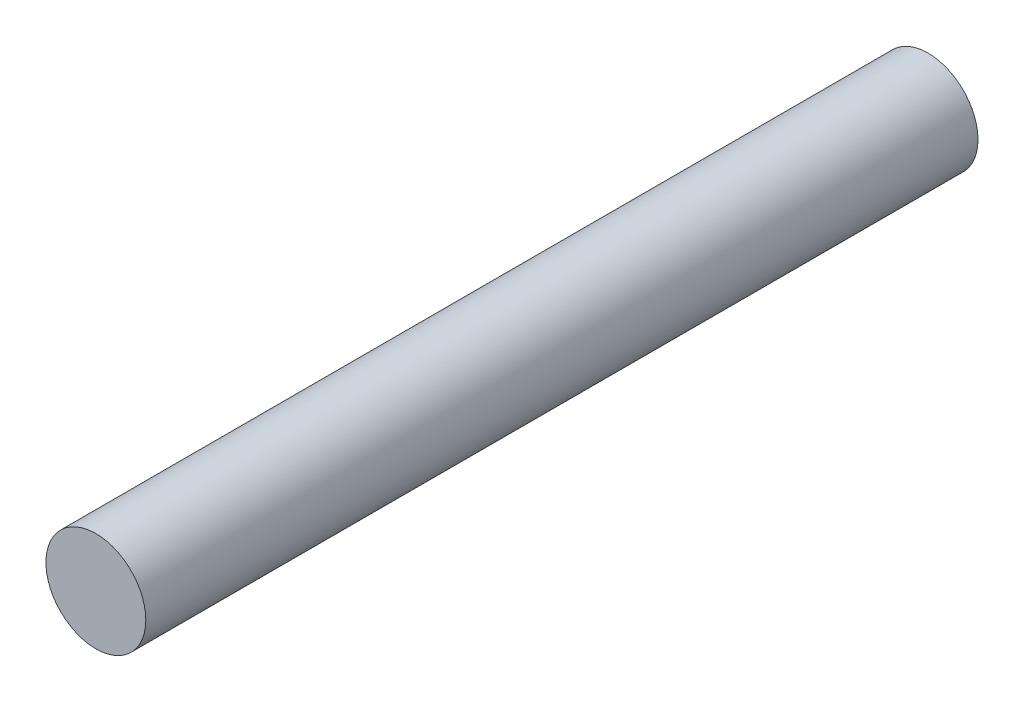
ISO-10303-21;
HEADER;
FILE_DESCRIPTION(('STEP AP214'),'2;1');
FILE_NAME('part.step','',(''),(''),'','','');
FILE_SCHEMA(('AUTOMOTIVE_DESIGN { 1 0 10303 214 1 1 1 1 }'));
ENDSEC;
DATA;
#1=APPLICATION_CONTEXT('core data for automotive mechanical design processes');
#2=APPLICATION_PROTOCOL_DEFINITION('international standard','automotive_design',2000,#1);
#3=PRODUCT_CONTEXT('',#1,'mechanical');
#4=PRODUCT('Part','Part','',(#3));
#5=PRODUCT_RELATED_PRODUCT_CATEGORY('part','',(#4));
#6=PRODUCT_DEFINITION_FORMATION('','',#4);
#7=PRODUCT_DEFINITION_CONTEXT('part definition',#1,'design');
#8=PRODUCT_DEFINITION('design','',#6,#7);
#9=PRODUCT_DEFINITION_SHAPE('','',#8);
#10=(LENGTH_UNIT() NAMED_UNIT(*) SI_UNIT(.MILLI.,.METRE.));
#11=(NAMED_UNIT(*) PLANE_ANGLE_UNIT() SI_UNIT($,.RADIAN.));
#12=(NAMED_UNIT(*) SI_UNIT($,.STERADIAN.) SOLID_ANGLE_UNIT());
#13=UNCERTAINTY_MEASURE_WITH_UNIT(LENGTH_MEASURE(1.E-05),#10,'distance_accuracy_value','');
#14=(GEOMETRIC_REPRESENTATION_CONTEXT(3) GLOBAL_UNCERTAINTY_ASSIGNED_CONTEXT((#13)) GLOBAL_UNIT_ASSIGNED_CONTEXT((#10,
#11,#12)) REPRESENTATION_CONTEXT('',''));
#15=CARTESIAN_POINT('',(0.,0.,0.));
#16=DIRECTION('',(0.,0.,1.));
#17=DIRECTION('',(1.,0.,0.));
#18=AXIS2_PLACEMENT_3D('',#15,#16,#17);
#19=CARTESIAN_POINT('',(0.,0.,25.));
#20=DIRECTION('',(0.,0.,-1.));
#21=DIRECTION('',(-1.,0.,0.));
#22=AXIS2_PLACEMENT_3D('',#19,#20,#21);
#23=CYLINDRICAL_SURFACE('',#22,1.5);
#24=CARTESIAN_POINT('',(0.,0.,25.));
#25=DIRECTION('',(0.,0.,1.));
#26=DIRECTION('',(1.,0.,0.));
#27=AXIS2_PLACEMENT_3D('',#24,#25,#26);
#28=CIRCLE('',#27,1.5);
#29=CARTESIAN_POINT('',(1.5,0.,25.));
#30=VERTEX_POINT('',#29);
#31=EDGE_CURVE('E10',#30,#30,#28,.T.);
#32=ORIENTED_EDGE('',*,*,#31,.F.);
#33=EDGE_LOOP('',(#32));
#34=FACE_BOUND('',#33,.T.);
#35=CARTESIAN_POINT('',(0.,0.,0.));
#36=DIRECTION('',(0.,0.,1.));
#37=DIRECTION('',(1.,0.,0.));
#38=AXIS2_PLACEMENT_3D('',#35,#36,#37);
#39=CIRCLE('',#38,1.5);
#40=CARTESIAN_POINT('',(1.5,0.,0.));
#41=VERTEX_POINT('',#40);
#42=EDGE_CURVE('E32',#41,#41,#39,.T.);
#43=ORIENTED_EDGE('',*,*,#42,.T.);
#44=EDGE_LOOP('',(#43));
#45=FACE_BOUND('',#44,.T.);
#46=ADVANCED_FACE('F29',(#34,#45),#23,.T.);
#47=CARTESIAN_POINT('',(0.,0.,25.));
#48=DIRECTION('',(0.,0.,1.));
#49=DIRECTION('',(1.,0.,0.));
#50=AXIS2_PLACEMENT_3D('',#47,#48,#49);
#51=PLANE('',#50);
#52=ORIENTED_EDGE('',*,*,#31,.T.);
#53=EDGE_LOOP('',(#52));
#54=FACE_BOUND('',#53,.T.);
#55=ADVANCED_FACE('F44',(#54),#51,.T.);
#56=CARTESIAN_POINT('',(0.,0.,0.));
#57=DIRECTION('',(0.,0.,1.));
#58=DIRECTION('',(1.,0.,0.));
#59=AXIS2_PLACEMENT_3D('',#56,#57,#58);
#60=PLANE('',#59);
#61=ORIENTED_EDGE('',*,*,#42,.F.);
#62=EDGE_LOOP('',(#61));
#63=FACE_BOUND('',#62,.T.);
#64=ADVANCED_FACE('F42',(#63),#60,.F.);
#65=CLOSED_SHELL('',(#46,#55,#64));
#66=MANIFOLD_SOLID_BREP('B2',#65);
#67=ADVANCED_BREP_SHAPE_REPRESENTATION('',(#18,#66),#14);
#68=SHAPE_DEFINITION_REPRESENTATION(#9,#67);
ENDSEC;
END-ISO-10303-21;
